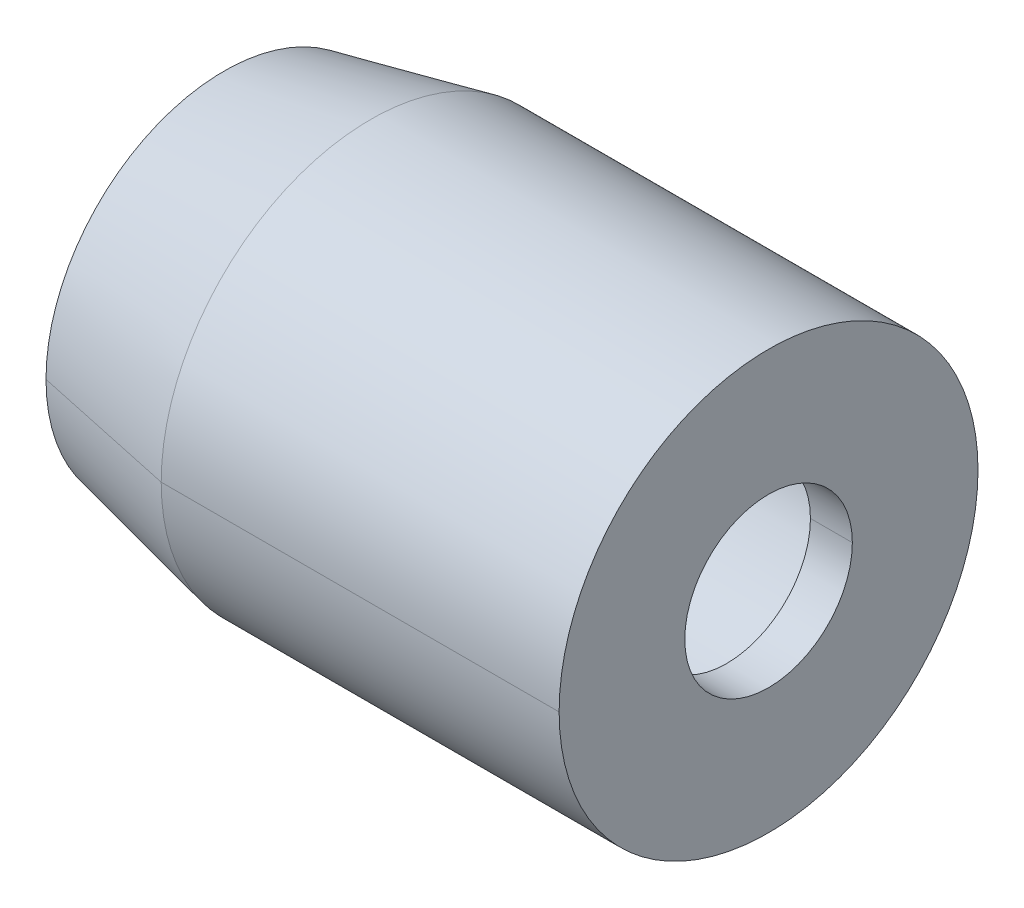
ISO-10303-21;
HEADER;
FILE_DESCRIPTION(('STEP AP214'),'2;1');
FILE_NAME('part.step','',(''),(''),'','','');
FILE_SCHEMA(('AUTOMOTIVE_DESIGN { 1 0 10303 214 1 1 1 1 }'));
ENDSEC;
DATA;
#1=APPLICATION_CONTEXT('core data for automotive mechanical design processes');
#2=APPLICATION_PROTOCOL_DEFINITION('international standard','automotive_design',2000,#1);
#3=PRODUCT_CONTEXT('',#1,'mechanical');
#4=PRODUCT('Part','Part','',(#3));
#5=PRODUCT_RELATED_PRODUCT_CATEGORY('part','',(#4));
#6=PRODUCT_DEFINITION_FORMATION('','',#4);
#7=PRODUCT_DEFINITION_CONTEXT('part definition',#1,'design');
#8=PRODUCT_DEFINITION('design','',#6,#7);
#9=PRODUCT_DEFINITION_SHAPE('','',#8);
#10=(LENGTH_UNIT() NAMED_UNIT(*) SI_UNIT(.MILLI.,.METRE.));
#11=(NAMED_UNIT(*) PLANE_ANGLE_UNIT() SI_UNIT($,.RADIAN.));
#12=(NAMED_UNIT(*) SI_UNIT($,.STERADIAN.) SOLID_ANGLE_UNIT());
#13=UNCERTAINTY_MEASURE_WITH_UNIT(LENGTH_MEASURE(1.E-05),#10,'distance_accuracy_value','');
#14=(GEOMETRIC_REPRESENTATION_CONTEXT(3) GLOBAL_UNCERTAINTY_ASSIGNED_CONTEXT((#13)) GLOBAL_UNIT_ASSIGNED_CONTEXT((#10,
#11,#12)) REPRESENTATION_CONTEXT('',''));
#15=CARTESIAN_POINT('',(0.,0.,0.));
#16=DIRECTION('',(0.,0.,1.));
#17=DIRECTION('',(1.,0.,0.));
#18=AXIS2_PLACEMENT_3D('',#15,#16,#17);
#19=CARTESIAN_POINT('',(-13.,0.,0.));
#20=DIRECTION('',(-1.,0.,0.));
#21=DIRECTION('',(0.,0.,1.));
#22=AXIS2_PLACEMENT_3D('',#19,#20,#21);
#23=CYLINDRICAL_SURFACE('',#22,7.);
#24=DIRECTION('',(-1.,0.,0.));
#25=VECTOR('',#24,1.);
#26=CARTESIAN_POINT('',(-13.,0.,-7.));
#27=LINE('',#26,#25);
#28=CARTESIAN_POINT('',(11.,0.,-7.));
#29=VERTEX_POINT('',#28);
#30=CARTESIAN_POINT('',(-13.,0.,-7.));
#31=VERTEX_POINT('',#30);
#32=EDGE_CURVE('E98',#29,#31,#27,.T.);
#33=ORIENTED_EDGE('',*,*,#32,.F.);
#34=CARTESIAN_POINT('',(11.,0.,0.));
#35=DIRECTION('',(-1.,0.,0.));
#36=DIRECTION('',(0.,0.,1.));
#37=AXIS2_PLACEMENT_3D('',#34,#35,#36);
#38=CIRCLE('',#37,7.);
#39=CARTESIAN_POINT('',(11.,0.,7.));
#40=VERTEX_POINT('',#39);
#41=EDGE_CURVE('E91',#40,#29,#38,.T.);
#42=ORIENTED_EDGE('',*,*,#41,.F.);
#43=DIRECTION('',(-1.,0.,0.));
#44=VECTOR('',#43,1.);
#45=CARTESIAN_POINT('',(-13.,0.,7.));
#46=LINE('',#45,#44);
#47=CARTESIAN_POINT('',(-13.,0.,7.));
#48=VERTEX_POINT('',#47);
#49=EDGE_CURVE('E100',#40,#48,#46,.T.);
#50=ORIENTED_EDGE('',*,*,#49,.T.);
#51=CARTESIAN_POINT('',(-13.,0.,0.));
#52=DIRECTION('',(-1.,0.,0.));
#53=DIRECTION('',(0.,0.,1.));
#54=AXIS2_PLACEMENT_3D('',#51,#52,#53);
#55=CIRCLE('',#54,7.);
#56=EDGE_CURVE('E11',#48,#31,#55,.T.);
#57=ORIENTED_EDGE('',*,*,#56,.T.);
#58=EDGE_LOOP('',(#33,#42,#50,#57));
#59=FACE_BOUND('',#58,.T.);
#60=ADVANCED_FACE('F16',(#59),#23,.F.);
#61=CARTESIAN_POINT('',(-13.,8.5,0.));
#62=DIRECTION('',(1.,0.,0.));
#63=DIRECTION('',(0.,1.,0.));
#64=AXIS2_PLACEMENT_3D('',#61,#62,#63);
#65=PLANE('',#64);
#66=ORIENTED_EDGE('',*,*,#56,.F.);
#67=CARTESIAN_POINT('',(-13.,0.,0.));
#68=DIRECTION('',(-1.,0.,0.));
#69=DIRECTION('',(0.,0.,1.));
#70=AXIS2_PLACEMENT_3D('',#67,#68,#69);
#71=CIRCLE('',#70,7.);
#72=EDGE_CURVE('E103',#31,#48,#71,.T.);
#73=ORIENTED_EDGE('',*,*,#72,.F.);
#74=EDGE_LOOP('',(#66,#73));
#75=FACE_BOUND('',#74,.T.);
#76=CARTESIAN_POINT('',(-13.,0.,0.));
#77=DIRECTION('',(-1.,0.,0.));
#78=DIRECTION('',(0.,0.,1.));
#79=AXIS2_PLACEMENT_3D('',#76,#77,#78);
#80=CIRCLE('',#79,8.5);
#81=CARTESIAN_POINT('',(-13.,0.,-8.5));
#82=VERTEX_POINT('',#81);
#83=CARTESIAN_POINT('',(-13.,0.,8.5));
#84=VERTEX_POINT('',#83);
#85=EDGE_CURVE('E27',#82,#84,#80,.T.);
#86=ORIENTED_EDGE('',*,*,#85,.T.);
#87=CARTESIAN_POINT('',(-13.,0.,0.));
#88=DIRECTION('',(-1.,0.,0.));
#89=DIRECTION('',(0.,0.,1.));
#90=AXIS2_PLACEMENT_3D('',#87,#88,#89);
#91=CIRCLE('',#90,8.5);
#92=EDGE_CURVE('E149',#84,#82,#91,.T.);
#93=ORIENTED_EDGE('',*,*,#92,.T.);
#94=EDGE_LOOP('',(#86,#93));
#95=FACE_BOUND('',#94,.T.);
#96=ADVANCED_FACE('F104',(#75,#95),#65,.F.);
#97=CARTESIAN_POINT('',(-6.,0.,0.));
#98=DIRECTION('',(1.,0.,0.));
#99=DIRECTION('',(0.,0.,-1.));
#100=AXIS2_PLACEMENT_3D('',#97,#98,#99);
#101=CONICAL_SURFACE('',#100,10.,0.211093333222746);
#102=DIRECTION('',(0.97780241407741,0.,0.209529088730873));
#103=VECTOR('',#102,1.);
#104=CARTESIAN_POINT('',(-6.,0.,10.));
#105=LINE('',#104,#103);
#106=CARTESIAN_POINT('',(-6.,0.,10.));
#107=VERTEX_POINT('',#106);
#108=EDGE_CURVE('E153',#84,#107,#105,.T.);
#109=ORIENTED_EDGE('',*,*,#108,.F.);
#110=ORIENTED_EDGE('',*,*,#85,.F.);
#111=DIRECTION('',(0.97780241407741,0.,-0.209529088730873));
#112=VECTOR('',#111,1.);
#113=CARTESIAN_POINT('',(-6.,0.,-10.));
#114=LINE('',#113,#112);
#115=CARTESIAN_POINT('',(-6.,0.,-10.));
#116=VERTEX_POINT('',#115);
#117=EDGE_CURVE('E131',#82,#116,#114,.T.);
#118=ORIENTED_EDGE('',*,*,#117,.T.);
#119=CARTESIAN_POINT('',(-6.,0.,0.));
#120=DIRECTION('',(-1.,0.,0.));
#121=DIRECTION('',(0.,0.,1.));
#122=AXIS2_PLACEMENT_3D('',#119,#120,#121);
#123=CIRCLE('',#122,10.);
#124=EDGE_CURVE('E123',#116,#107,#123,.T.);
#125=ORIENTED_EDGE('',*,*,#124,.T.);
#126=EDGE_LOOP('',(#109,#110,#118,#125));
#127=FACE_BOUND('',#126,.T.);
#128=ADVANCED_FACE('F175',(#127),#101,.T.);
#129=CARTESIAN_POINT('',(-13.,0.,0.));
#130=DIRECTION('',(-1.,0.,0.));
#131=DIRECTION('',(0.,0.,1.));
#132=AXIS2_PLACEMENT_3D('',#129,#130,#131);
#133=CYLINDRICAL_SURFACE('',#132,10.);
#134=DIRECTION('',(-1.,0.,0.));
#135=VECTOR('',#134,1.);
#136=CARTESIAN_POINT('',(-13.,0.,-10.));
#137=LINE('',#136,#135);
#138=CARTESIAN_POINT('',(13.,0.,-10.));
#139=VERTEX_POINT('',#138);
#140=EDGE_CURVE('E139',#139,#116,#137,.T.);
#141=ORIENTED_EDGE('',*,*,#140,.F.);
#142=CARTESIAN_POINT('',(13.,0.,0.));
#143=DIRECTION('',(-1.,0.,0.));
#144=DIRECTION('',(0.,0.,1.));
#145=AXIS2_PLACEMENT_3D('',#142,#143,#144);
#146=CIRCLE('',#145,10.);
#147=CARTESIAN_POINT('',(13.,0.,10.));
#148=VERTEX_POINT('',#147);
#149=EDGE_CURVE('E125',#139,#148,#146,.T.);
#150=ORIENTED_EDGE('',*,*,#149,.T.);
#151=DIRECTION('',(-1.,0.,0.));
#152=VECTOR('',#151,1.);
#153=CARTESIAN_POINT('',(-13.,0.,10.));
#154=LINE('',#153,#152);
#155=EDGE_CURVE('E143',#148,#107,#154,.T.);
#156=ORIENTED_EDGE('',*,*,#155,.T.);
#157=ORIENTED_EDGE('',*,*,#124,.F.);
#158=EDGE_LOOP('',(#141,#150,#156,#157));
#159=FACE_BOUND('',#158,.T.);
#160=ADVANCED_FACE('F172',(#159),#133,.T.);
#161=CARTESIAN_POINT('',(13.,4.,0.));
#162=DIRECTION('',(-1.,0.,0.));
#163=DIRECTION('',(0.,0.,1.));
#164=AXIS2_PLACEMENT_3D('',#161,#162,#163);
#165=PLANE('',#164);
#166=CARTESIAN_POINT('',(13.,0.,0.));
#167=DIRECTION('',(-1.,0.,0.));
#168=DIRECTION('',(0.,0.,1.));
#169=AXIS2_PLACEMENT_3D('',#166,#167,#168);
#170=CIRCLE('',#169,4.);
#171=CARTESIAN_POINT('',(13.,0.,4.));
#172=VERTEX_POINT('',#171);
#173=CARTESIAN_POINT('',(13.,0.,-4.));
#174=VERTEX_POINT('',#173);
#175=EDGE_CURVE('E144',#172,#174,#170,.T.);
#176=ORIENTED_EDGE('',*,*,#175,.T.);
#177=CARTESIAN_POINT('',(13.,0.,0.));
#178=DIRECTION('',(-1.,0.,0.));
#179=DIRECTION('',(0.,0.,1.));
#180=AXIS2_PLACEMENT_3D('',#177,#178,#179);
#181=CIRCLE('',#180,4.);
#182=EDGE_CURVE('E121',#174,#172,#181,.T.);
#183=ORIENTED_EDGE('',*,*,#182,.T.);
#184=EDGE_LOOP('',(#176,#183));
#185=FACE_BOUND('',#184,.T.);
#186=CARTESIAN_POINT('',(13.,0.,0.));
#187=DIRECTION('',(-1.,0.,0.));
#188=DIRECTION('',(0.,0.,1.));
#189=AXIS2_PLACEMENT_3D('',#186,#187,#188);
#190=CIRCLE('',#189,10.);
#191=EDGE_CURVE('E135',#148,#139,#190,.T.);
#192=ORIENTED_EDGE('',*,*,#191,.F.);
#193=ORIENTED_EDGE('',*,*,#149,.F.);
#194=EDGE_LOOP('',(#192,#193));
#195=FACE_BOUND('',#194,.T.);
#196=ADVANCED_FACE('F18',(#185,#195),#165,.F.);
#197=CARTESIAN_POINT('',(-13.,0.,0.));
#198=DIRECTION('',(-1.,0.,0.));
#199=DIRECTION('',(0.,0.,1.));
#200=AXIS2_PLACEMENT_3D('',#197,#198,#199);
#201=CYLINDRICAL_SURFACE('',#200,4.);
#202=DIRECTION('',(-1.,0.,0.));
#203=VECTOR('',#202,1.);
#204=CARTESIAN_POINT('',(-13.,0.,-4.));
#205=LINE('',#204,#203);
#206=CARTESIAN_POINT('',(11.,0.,-4.));
#207=VERTEX_POINT('',#206);
#208=EDGE_CURVE('E20',#174,#207,#205,.T.);
#209=ORIENTED_EDGE('',*,*,#208,.F.);
#210=ORIENTED_EDGE('',*,*,#175,.F.);
#211=DIRECTION('',(-1.,0.,0.));
#212=VECTOR('',#211,1.);
#213=CARTESIAN_POINT('',(-13.,0.,4.));
#214=LINE('',#213,#212);
#215=CARTESIAN_POINT('',(11.,0.,4.));
#216=VERTEX_POINT('',#215);
#217=EDGE_CURVE('E130',#172,#216,#214,.T.);
#218=ORIENTED_EDGE('',*,*,#217,.T.);
#219=CARTESIAN_POINT('',(11.,0.,0.));
#220=DIRECTION('',(-1.,0.,0.));
#221=DIRECTION('',(0.,0.,1.));
#222=AXIS2_PLACEMENT_3D('',#219,#220,#221);
#223=CIRCLE('',#222,4.);
#224=EDGE_CURVE('E41',#216,#207,#223,.T.);
#225=ORIENTED_EDGE('',*,*,#224,.T.);
#226=EDGE_LOOP('',(#209,#210,#218,#225));
#227=FACE_BOUND('',#226,.T.);
#228=ADVANCED_FACE('F197',(#227),#201,.F.);
#229=CARTESIAN_POINT('',(11.,7.,0.));
#230=DIRECTION('',(1.,0.,0.));
#231=DIRECTION('',(0.,1.,0.));
#232=AXIS2_PLACEMENT_3D('',#229,#230,#231);
#233=PLANE('',#232);
#234=ORIENTED_EDGE('',*,*,#224,.F.);
#235=CARTESIAN_POINT('',(11.,0.,0.));
#236=DIRECTION('',(-1.,0.,0.));
#237=DIRECTION('',(0.,0.,1.));
#238=AXIS2_PLACEMENT_3D('',#235,#236,#237);
#239=CIRCLE('',#238,4.);
#240=EDGE_CURVE('E126',#207,#216,#239,.T.);
#241=ORIENTED_EDGE('',*,*,#240,.F.);
#242=EDGE_LOOP('',(#234,#241));
#243=FACE_BOUND('',#242,.T.);
#244=ORIENTED_EDGE('',*,*,#41,.T.);
#245=CARTESIAN_POINT('',(11.,0.,0.));
#246=DIRECTION('',(-1.,0.,0.));
#247=DIRECTION('',(0.,0.,1.));
#248=AXIS2_PLACEMENT_3D('',#245,#246,#247);
#249=CIRCLE('',#248,7.);
#250=EDGE_CURVE('E110',#29,#40,#249,.T.);
#251=ORIENTED_EDGE('',*,*,#250,.T.);
#252=EDGE_LOOP('',(#244,#251));
#253=FACE_BOUND('',#252,.T.);
#254=ADVANCED_FACE('F201',(#243,#253),#233,.F.);
#255=CARTESIAN_POINT('',(-13.,0.,0.));
#256=DIRECTION('',(-1.,0.,0.));
#257=DIRECTION('',(0.,0.,1.));
#258=AXIS2_PLACEMENT_3D('',#255,#256,#257);
#259=CYLINDRICAL_SURFACE('',#258,4.);
#260=ORIENTED_EDGE('',*,*,#182,.F.);
#261=ORIENTED_EDGE('',*,*,#208,.T.);
#262=ORIENTED_EDGE('',*,*,#240,.T.);
#263=ORIENTED_EDGE('',*,*,#217,.F.);
#264=EDGE_LOOP('',(#260,#261,#262,#263));
#265=FACE_BOUND('',#264,.T.);
#266=ADVANCED_FACE('F204',(#265),#259,.F.);
#267=CARTESIAN_POINT('',(-13.,0.,0.));
#268=DIRECTION('',(-1.,0.,0.));
#269=DIRECTION('',(0.,0.,1.));
#270=AXIS2_PLACEMENT_3D('',#267,#268,#269);
#271=CYLINDRICAL_SURFACE('',#270,10.);
#272=ORIENTED_EDGE('',*,*,#191,.T.);
#273=ORIENTED_EDGE('',*,*,#140,.T.);
#274=CARTESIAN_POINT('',(-6.,0.,0.));
#275=DIRECTION('',(-1.,0.,0.));
#276=DIRECTION('',(0.,0.,1.));
#277=AXIS2_PLACEMENT_3D('',#274,#275,#276);
#278=CIRCLE('',#277,10.);
#279=EDGE_CURVE('E136',#107,#116,#278,.T.);
#280=ORIENTED_EDGE('',*,*,#279,.F.);
#281=ORIENTED_EDGE('',*,*,#155,.F.);
#282=EDGE_LOOP('',(#272,#273,#280,#281));
#283=FACE_BOUND('',#282,.T.);
#284=ADVANCED_FACE('F166',(#283),#271,.T.);
#285=CARTESIAN_POINT('',(-6.,0.,0.));
#286=DIRECTION('',(1.,0.,0.));
#287=DIRECTION('',(0.,0.,-1.));
#288=AXIS2_PLACEMENT_3D('',#285,#286,#287);
#289=CONICAL_SURFACE('',#288,10.,0.211093333222746);
#290=ORIENTED_EDGE('',*,*,#92,.F.);
#291=ORIENTED_EDGE('',*,*,#108,.T.);
#292=ORIENTED_EDGE('',*,*,#279,.T.);
#293=ORIENTED_EDGE('',*,*,#117,.F.);
#294=EDGE_LOOP('',(#290,#291,#292,#293));
#295=FACE_BOUND('',#294,.T.);
#296=ADVANCED_FACE('F181',(#295),#289,.T.);
#297=CARTESIAN_POINT('',(-13.,0.,0.));
#298=DIRECTION('',(-1.,0.,0.));
#299=DIRECTION('',(0.,0.,1.));
#300=AXIS2_PLACEMENT_3D('',#297,#298,#299);
#301=CYLINDRICAL_SURFACE('',#300,7.);
#302=ORIENTED_EDGE('',*,*,#250,.F.);
#303=ORIENTED_EDGE('',*,*,#32,.T.);
#304=ORIENTED_EDGE('',*,*,#72,.T.);
#305=ORIENTED_EDGE('',*,*,#49,.F.);
#306=EDGE_LOOP('',(#302,#303,#304,#305));
#307=FACE_BOUND('',#306,.T.);
#308=ADVANCED_FACE('F108',(#307),#301,.F.);
#309=CLOSED_SHELL('',(#60,#96,#128,#160,#196,#228,#254,#266,#284,#296,#308));
#310=MANIFOLD_SOLID_BREP('B1',#309);
#311=ADVANCED_BREP_SHAPE_REPRESENTATION('',(#18,#310),#14);
#312=SHAPE_DEFINITION_REPRESENTATION(#9,#311);
ENDSEC;
END-ISO-10303-21;
